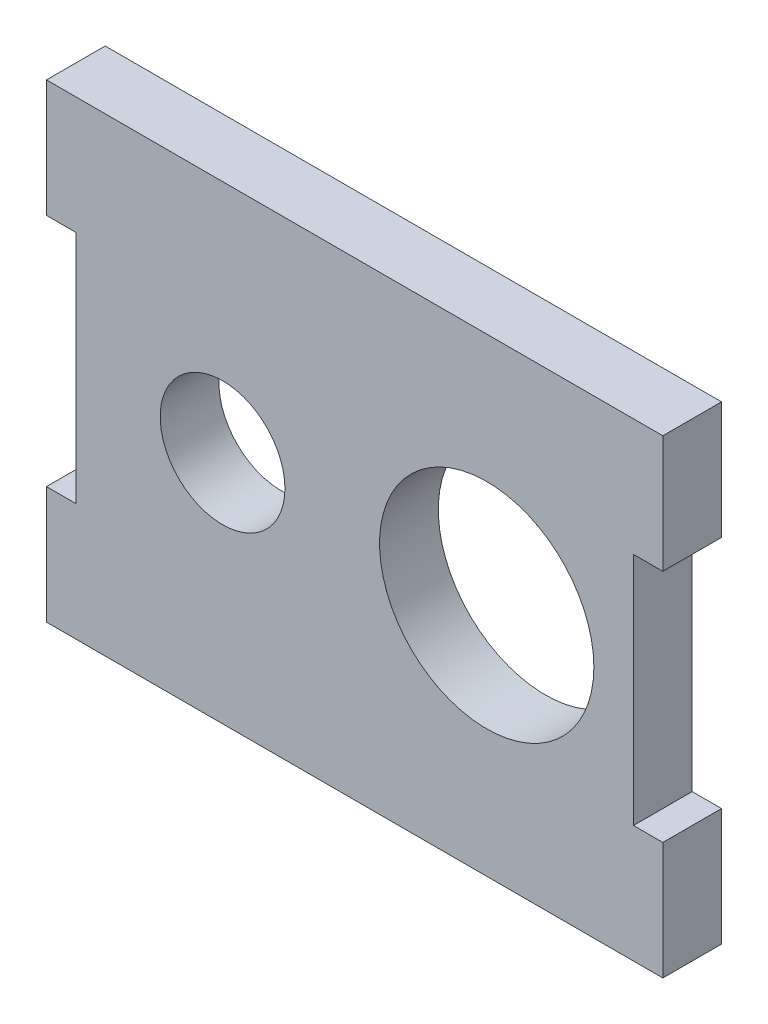
ISO-10303-21;
HEADER;
FILE_DESCRIPTION(('STEP AP214'),'2;1');
FILE_NAME('part.step','',(''),(''),'','','');
FILE_SCHEMA(('AUTOMOTIVE_DESIGN { 1 0 10303 214 1 1 1 1 }'));
ENDSEC;
DATA;
#1=APPLICATION_CONTEXT('core data for automotive mechanical design processes');
#2=APPLICATION_PROTOCOL_DEFINITION('international standard','automotive_design',2000,#1);
#3=PRODUCT_CONTEXT('',#1,'mechanical');
#4=PRODUCT('Part','Part','',(#3));
#5=PRODUCT_RELATED_PRODUCT_CATEGORY('part','',(#4));
#6=PRODUCT_DEFINITION_FORMATION('','',#4);
#7=PRODUCT_DEFINITION_CONTEXT('part definition',#1,'design');
#8=PRODUCT_DEFINITION('design','',#6,#7);
#9=PRODUCT_DEFINITION_SHAPE('','',#8);
#10=(LENGTH_UNIT() NAMED_UNIT(*) SI_UNIT(.MILLI.,.METRE.));
#11=(NAMED_UNIT(*) PLANE_ANGLE_UNIT() SI_UNIT($,.RADIAN.));
#12=(NAMED_UNIT(*) SI_UNIT($,.STERADIAN.) SOLID_ANGLE_UNIT());
#13=UNCERTAINTY_MEASURE_WITH_UNIT(LENGTH_MEASURE(1.E-05),#10,'distance_accuracy_value','');
#14=(GEOMETRIC_REPRESENTATION_CONTEXT(3) GLOBAL_UNCERTAINTY_ASSIGNED_CONTEXT((#13)) GLOBAL_UNIT_ASSIGNED_CONTEXT((#10,
#11,#12)) REPRESENTATION_CONTEXT('',''));
#15=CARTESIAN_POINT('',(0.,0.,0.));
#16=DIRECTION('',(0.,0.,1.));
#17=DIRECTION('',(1.,0.,0.));
#18=AXIS2_PLACEMENT_3D('',#15,#16,#17);
#19=CARTESIAN_POINT('',(543.697024667252,-402.673514651459,2.));
#20=DIRECTION('',(0.,0.,-1.));
#21=DIRECTION('',(-1.,0.,0.));
#22=AXIS2_PLACEMENT_3D('',#19,#20,#21);
#23=PLANE('',#22);
#24=DIRECTION('',(0.,1.,0.));
#25=VECTOR('',#24,1.);
#26=CARTESIAN_POINT('',(543.697024667252,-406.673514651459,2.));
#27=LINE('',#26,#25);
#28=CARTESIAN_POINT('',(543.697024667252,-406.673514651459,2.));
#29=VERTEX_POINT('',#28);
#30=CARTESIAN_POINT('',(543.697024667252,-402.673514651459,2.));
#31=VERTEX_POINT('',#30);
#32=EDGE_CURVE('E181',#29,#31,#27,.T.);
#33=ORIENTED_EDGE('',*,*,#32,.T.);
#34=DIRECTION('',(-1.,0.,0.));
#35=VECTOR('',#34,1.);
#36=CARTESIAN_POINT('',(542.697024667252,-402.673514651459,2.));
#37=LINE('',#36,#35);
#38=CARTESIAN_POINT('',(542.697024667252,-402.673514651459,2.));
#39=VERTEX_POINT('',#38);
#40=EDGE_CURVE('E109',#31,#39,#37,.T.);
#41=ORIENTED_EDGE('',*,*,#40,.T.);
#42=DIRECTION('',(0.,1.,0.));
#43=VECTOR('',#42,1.);
#44=CARTESIAN_POINT('',(542.697024667252,-394.673514651459,2.));
#45=LINE('',#44,#43);
#46=CARTESIAN_POINT('',(542.697024667252,-394.673514651459,2.));
#47=VERTEX_POINT('',#46);
#48=EDGE_CURVE('E208',#39,#47,#45,.T.);
#49=ORIENTED_EDGE('',*,*,#48,.T.);
#50=DIRECTION('',(1.,0.,0.));
#51=VECTOR('',#50,1.);
#52=CARTESIAN_POINT('',(542.697024667252,-394.673514651459,2.));
#53=LINE('',#52,#51);
#54=CARTESIAN_POINT('',(543.697024667252,-394.673514651459,2.));
#55=VERTEX_POINT('',#54);
#56=EDGE_CURVE('E227',#47,#55,#53,.T.);
#57=ORIENTED_EDGE('',*,*,#56,.T.);
#58=DIRECTION('',(0.,1.,0.));
#59=VECTOR('',#58,1.);
#60=CARTESIAN_POINT('',(543.697024667252,-394.673514651459,2.));
#61=LINE('',#60,#59);
#62=CARTESIAN_POINT('',(543.697024667252,-390.673514651459,2.));
#63=VERTEX_POINT('',#62);
#64=EDGE_CURVE('E224',#55,#63,#61,.T.);
#65=ORIENTED_EDGE('',*,*,#64,.T.);
#66=DIRECTION('',(-1.,0.,0.));
#67=VECTOR('',#66,1.);
#68=CARTESIAN_POINT('',(543.697024667252,-390.673514651459,2.));
#69=LINE('',#68,#67);
#70=CARTESIAN_POINT('',(522.697024667252,-390.673514651459,2.));
#71=VERTEX_POINT('',#70);
#72=EDGE_CURVE('E226',#63,#71,#69,.T.);
#73=ORIENTED_EDGE('',*,*,#72,.T.);
#74=DIRECTION('',(0.,-1.,0.));
#75=VECTOR('',#74,1.);
#76=CARTESIAN_POINT('',(522.697024667252,-394.673514651459,2.));
#77=LINE('',#76,#75);
#78=CARTESIAN_POINT('',(522.697024667252,-394.673514651459,2.));
#79=VERTEX_POINT('',#78);
#80=EDGE_CURVE('E229',#71,#79,#77,.T.);
#81=ORIENTED_EDGE('',*,*,#80,.T.);
#82=DIRECTION('',(1.,0.,0.));
#83=VECTOR('',#82,1.);
#84=CARTESIAN_POINT('',(522.697024667252,-394.673514651459,2.));
#85=LINE('',#84,#83);
#86=CARTESIAN_POINT('',(523.697024667252,-394.673514651459,2.));
#87=VERTEX_POINT('',#86);
#88=EDGE_CURVE('E235',#79,#87,#85,.T.);
#89=ORIENTED_EDGE('',*,*,#88,.T.);
#90=DIRECTION('',(0.,-1.,0.));
#91=VECTOR('',#90,1.);
#92=CARTESIAN_POINT('',(523.697024667252,-394.673514651459,2.));
#93=LINE('',#92,#91);
#94=CARTESIAN_POINT('',(523.697024667252,-402.673514651459,2.));
#95=VERTEX_POINT('',#94);
#96=EDGE_CURVE('E140',#87,#95,#93,.T.);
#97=ORIENTED_EDGE('',*,*,#96,.T.);
#98=DIRECTION('',(-1.,0.,0.));
#99=VECTOR('',#98,1.);
#100=CARTESIAN_POINT('',(522.697024667252,-402.673514651459,2.));
#101=LINE('',#100,#99);
#102=CARTESIAN_POINT('',(522.697024667252,-402.673514651459,2.));
#103=VERTEX_POINT('',#102);
#104=EDGE_CURVE('E134',#95,#103,#101,.T.);
#105=ORIENTED_EDGE('',*,*,#104,.T.);
#106=DIRECTION('',(0.,-1.,0.));
#107=VECTOR('',#106,1.);
#108=CARTESIAN_POINT('',(522.697024667252,-406.673514651459,2.));
#109=LINE('',#108,#107);
#110=CARTESIAN_POINT('',(522.697024667252,-406.673514651459,2.));
#111=VERTEX_POINT('',#110);
#112=EDGE_CURVE('E138',#103,#111,#109,.T.);
#113=ORIENTED_EDGE('',*,*,#112,.T.);
#114=DIRECTION('',(1.,0.,0.));
#115=VECTOR('',#114,1.);
#116=CARTESIAN_POINT('',(543.697024667252,-406.673514651459,2.));
#117=LINE('',#116,#115);
#118=EDGE_CURVE('E54',#111,#29,#117,.T.);
#119=ORIENTED_EDGE('',*,*,#118,.T.);
#120=EDGE_LOOP('',(#33,#41,#49,#57,#65,#73,#81,#89,#97,#105,#113,#119));
#121=FACE_BOUND('',#120,.T.);
#122=CARTESIAN_POINT('',(537.697024667252,-398.673514651459,2.));
#123=DIRECTION('',(0.,0.,1.));
#124=DIRECTION('',(1.,0.,0.));
#125=AXIS2_PLACEMENT_3D('',#122,#123,#124);
#126=CIRCLE('',#125,3.65000000000004);
#127=CARTESIAN_POINT('',(541.347024667252,-398.673514651459,2.));
#128=VERTEX_POINT('',#127);
#129=EDGE_CURVE('E162',#128,#128,#126,.T.);
#130=ORIENTED_EDGE('',*,*,#129,.F.);
#131=EDGE_LOOP('',(#130));
#132=FACE_BOUND('',#131,.T.);
#133=CARTESIAN_POINT('',(528.697024667252,-398.673514651459,2.));
#134=DIRECTION('',(0.,0.,1.));
#135=DIRECTION('',(1.,0.,0.));
#136=AXIS2_PLACEMENT_3D('',#133,#134,#135);
#137=CIRCLE('',#136,2.12500000000001);
#138=CARTESIAN_POINT('',(530.822024667252,-398.673514651459,2.));
#139=VERTEX_POINT('',#138);
#140=EDGE_CURVE('E276',#139,#139,#137,.T.);
#141=ORIENTED_EDGE('',*,*,#140,.F.);
#142=EDGE_LOOP('',(#141));
#143=FACE_BOUND('',#142,.T.);
#144=ADVANCED_FACE('F37',(#121,#132,#143),#23,.F.);
#145=CARTESIAN_POINT('',(543.697024667252,-402.673514651459,0.));
#146=DIRECTION('',(0.,0.,-1.));
#147=DIRECTION('',(-1.,0.,0.));
#148=AXIS2_PLACEMENT_3D('',#145,#146,#147);
#149=PLANE('',#148);
#150=CARTESIAN_POINT('',(537.697024667252,-398.673514651459,0.));
#151=DIRECTION('',(0.,0.,1.));
#152=DIRECTION('',(1.,0.,0.));
#153=AXIS2_PLACEMENT_3D('',#150,#151,#152);
#154=CIRCLE('',#153,3.65000000000004);
#155=CARTESIAN_POINT('',(541.347024667252,-398.673514651459,0.));
#156=VERTEX_POINT('',#155);
#157=EDGE_CURVE('E281',#156,#156,#154,.T.);
#158=ORIENTED_EDGE('',*,*,#157,.T.);
#159=EDGE_LOOP('',(#158));
#160=FACE_BOUND('',#159,.T.);
#161=DIRECTION('',(0.,1.,0.));
#162=VECTOR('',#161,1.);
#163=CARTESIAN_POINT('',(543.697024667252,-406.673514651459,0.));
#164=LINE('',#163,#162);
#165=CARTESIAN_POINT('',(543.697024667252,-406.673514651459,0.));
#166=VERTEX_POINT('',#165);
#167=CARTESIAN_POINT('',(543.697024667252,-402.673514651459,0.));
#168=VERTEX_POINT('',#167);
#169=EDGE_CURVE('E158',#166,#168,#164,.T.);
#170=ORIENTED_EDGE('',*,*,#169,.F.);
#171=DIRECTION('',(1.,0.,0.));
#172=VECTOR('',#171,1.);
#173=CARTESIAN_POINT('',(543.697024667252,-406.673514651459,0.));
#174=LINE('',#173,#172);
#175=CARTESIAN_POINT('',(522.697024667252,-406.673514651459,0.));
#176=VERTEX_POINT('',#175);
#177=EDGE_CURVE('E101',#176,#166,#174,.T.);
#178=ORIENTED_EDGE('',*,*,#177,.F.);
#179=DIRECTION('',(0.,-1.,0.));
#180=VECTOR('',#179,1.);
#181=CARTESIAN_POINT('',(522.697024667252,-406.673514651459,0.));
#182=LINE('',#181,#180);
#183=CARTESIAN_POINT('',(522.697024667252,-402.673514651459,0.));
#184=VERTEX_POINT('',#183);
#185=EDGE_CURVE('E95',#184,#176,#182,.T.);
#186=ORIENTED_EDGE('',*,*,#185,.F.);
#187=DIRECTION('',(-1.,0.,0.));
#188=VECTOR('',#187,1.);
#189=CARTESIAN_POINT('',(522.697024667252,-402.673514651459,0.));
#190=LINE('',#189,#188);
#191=CARTESIAN_POINT('',(523.697024667252,-402.673514651459,0.));
#192=VERTEX_POINT('',#191);
#193=EDGE_CURVE('E148',#192,#184,#190,.T.);
#194=ORIENTED_EDGE('',*,*,#193,.F.);
#195=DIRECTION('',(0.,-1.,0.));
#196=VECTOR('',#195,1.);
#197=CARTESIAN_POINT('',(523.697024667252,-394.673514651459,0.));
#198=LINE('',#197,#196);
#199=CARTESIAN_POINT('',(523.697024667252,-394.673514651459,0.));
#200=VERTEX_POINT('',#199);
#201=EDGE_CURVE('E176',#200,#192,#198,.T.);
#202=ORIENTED_EDGE('',*,*,#201,.F.);
#203=DIRECTION('',(1.,0.,0.));
#204=VECTOR('',#203,1.);
#205=CARTESIAN_POINT('',(522.697024667252,-394.673514651459,0.));
#206=LINE('',#205,#204);
#207=CARTESIAN_POINT('',(522.697024667252,-394.673514651459,0.));
#208=VERTEX_POINT('',#207);
#209=EDGE_CURVE('E174',#208,#200,#206,.T.);
#210=ORIENTED_EDGE('',*,*,#209,.F.);
#211=DIRECTION('',(0.,-1.,0.));
#212=VECTOR('',#211,1.);
#213=CARTESIAN_POINT('',(522.697024667252,-394.673514651459,0.));
#214=LINE('',#213,#212);
#215=CARTESIAN_POINT('',(522.697024667252,-390.673514651459,0.));
#216=VERTEX_POINT('',#215);
#217=EDGE_CURVE('E172',#216,#208,#214,.T.);
#218=ORIENTED_EDGE('',*,*,#217,.F.);
#219=DIRECTION('',(-1.,0.,0.));
#220=VECTOR('',#219,1.);
#221=CARTESIAN_POINT('',(543.697024667252,-390.673514651459,0.));
#222=LINE('',#221,#220);
#223=CARTESIAN_POINT('',(543.697024667252,-390.673514651459,0.));
#224=VERTEX_POINT('',#223);
#225=EDGE_CURVE('E170',#224,#216,#222,.T.);
#226=ORIENTED_EDGE('',*,*,#225,.F.);
#227=DIRECTION('',(0.,1.,0.));
#228=VECTOR('',#227,1.);
#229=CARTESIAN_POINT('',(543.697024667252,-394.673514651459,0.));
#230=LINE('',#229,#228);
#231=CARTESIAN_POINT('',(543.697024667252,-394.673514651459,0.));
#232=VERTEX_POINT('',#231);
#233=EDGE_CURVE('E168',#232,#224,#230,.T.);
#234=ORIENTED_EDGE('',*,*,#233,.F.);
#235=DIRECTION('',(1.,0.,0.));
#236=VECTOR('',#235,1.);
#237=CARTESIAN_POINT('',(542.697024667252,-394.673514651459,0.));
#238=LINE('',#237,#236);
#239=CARTESIAN_POINT('',(542.697024667252,-394.673514651459,0.));
#240=VERTEX_POINT('',#239);
#241=EDGE_CURVE('E166',#240,#232,#238,.T.);
#242=ORIENTED_EDGE('',*,*,#241,.F.);
#243=DIRECTION('',(0.,1.,0.));
#244=VECTOR('',#243,1.);
#245=CARTESIAN_POINT('',(542.697024667252,-394.673514651459,0.));
#246=LINE('',#245,#244);
#247=CARTESIAN_POINT('',(542.697024667252,-402.673514651459,0.));
#248=VERTEX_POINT('',#247);
#249=EDGE_CURVE('E164',#248,#240,#246,.T.);
#250=ORIENTED_EDGE('',*,*,#249,.F.);
#251=DIRECTION('',(-1.,0.,0.));
#252=VECTOR('',#251,1.);
#253=CARTESIAN_POINT('',(542.697024667252,-402.673514651459,0.));
#254=LINE('',#253,#252);
#255=EDGE_CURVE('E161',#168,#248,#254,.T.);
#256=ORIENTED_EDGE('',*,*,#255,.F.);
#257=EDGE_LOOP('',(#170,#178,#186,#194,#202,#210,#218,#226,#234,#242,#250,#256));
#258=FACE_BOUND('',#257,.T.);
#259=CARTESIAN_POINT('',(528.697024667252,-398.673514651459,0.));
#260=DIRECTION('',(0.,0.,1.));
#261=DIRECTION('',(1.,0.,0.));
#262=AXIS2_PLACEMENT_3D('',#259,#260,#261);
#263=CIRCLE('',#262,2.12500000000001);
#264=CARTESIAN_POINT('',(530.822024667252,-398.673514651459,0.));
#265=VERTEX_POINT('',#264);
#266=EDGE_CURVE('E279',#265,#265,#263,.T.);
#267=ORIENTED_EDGE('',*,*,#266,.T.);
#268=EDGE_LOOP('',(#267));
#269=FACE_BOUND('',#268,.T.);
#270=ADVANCED_FACE('F212',(#160,#258,#269),#149,.T.);
#271=CARTESIAN_POINT('',(543.697024667252,-406.673514651459,2.));
#272=DIRECTION('',(-1.,0.,0.));
#273=DIRECTION('',(0.,0.,1.));
#274=AXIS2_PLACEMENT_3D('',#271,#272,#273);
#275=PLANE('',#274);
#276=ORIENTED_EDGE('',*,*,#169,.T.);
#277=DIRECTION('',(0.,0.,-1.));
#278=VECTOR('',#277,1.);
#279=CARTESIAN_POINT('',(543.697024667252,-402.673514651459,2.));
#280=LINE('',#279,#278);
#281=EDGE_CURVE('E11',#31,#168,#280,.T.);
#282=ORIENTED_EDGE('',*,*,#281,.F.);
#283=ORIENTED_EDGE('',*,*,#32,.F.);
#284=DIRECTION('',(0.,0.,-1.));
#285=VECTOR('',#284,1.);
#286=CARTESIAN_POINT('',(543.697024667252,-406.673514651459,2.));
#287=LINE('',#286,#285);
#288=EDGE_CURVE('E154',#29,#166,#287,.T.);
#289=ORIENTED_EDGE('',*,*,#288,.T.);
#290=EDGE_LOOP('',(#276,#282,#283,#289));
#291=FACE_BOUND('',#290,.T.);
#292=ADVANCED_FACE('F39',(#291),#275,.F.);
#293=CARTESIAN_POINT('',(542.697024667252,-402.673514651459,2.));
#294=DIRECTION('',(0.,-1.,0.));
#295=DIRECTION('',(0.,0.,-1.));
#296=AXIS2_PLACEMENT_3D('',#293,#294,#295);
#297=PLANE('',#296);
#298=ORIENTED_EDGE('',*,*,#255,.T.);
#299=DIRECTION('',(0.,0.,-1.));
#300=VECTOR('',#299,1.);
#301=CARTESIAN_POINT('',(542.697024667252,-402.673514651459,2.));
#302=LINE('',#301,#300);
#303=EDGE_CURVE('E46',#39,#248,#302,.T.);
#304=ORIENTED_EDGE('',*,*,#303,.F.);
#305=ORIENTED_EDGE('',*,*,#40,.F.);
#306=ORIENTED_EDGE('',*,*,#281,.T.);
#307=EDGE_LOOP('',(#298,#304,#305,#306));
#308=FACE_BOUND('',#307,.T.);
#309=ADVANCED_FACE('F356',(#308),#297,.F.);
#310=CARTESIAN_POINT('',(542.697024667252,-394.673514651459,2.));
#311=DIRECTION('',(-1.,0.,0.));
#312=DIRECTION('',(0.,0.,1.));
#313=AXIS2_PLACEMENT_3D('',#310,#311,#312);
#314=PLANE('',#313);
#315=ORIENTED_EDGE('',*,*,#249,.T.);
#316=DIRECTION('',(0.,0.,-1.));
#317=VECTOR('',#316,1.);
#318=CARTESIAN_POINT('',(542.697024667252,-394.673514651459,2.));
#319=LINE('',#318,#317);
#320=EDGE_CURVE('E200',#47,#240,#319,.T.);
#321=ORIENTED_EDGE('',*,*,#320,.F.);
#322=ORIENTED_EDGE('',*,*,#48,.F.);
#323=ORIENTED_EDGE('',*,*,#303,.T.);
#324=EDGE_LOOP('',(#315,#321,#322,#323));
#325=FACE_BOUND('',#324,.T.);
#326=ADVANCED_FACE('F206',(#325),#314,.F.);
#327=CARTESIAN_POINT('',(542.697024667252,-394.673514651459,2.));
#328=DIRECTION('',(0.,1.,0.));
#329=DIRECTION('',(0.,0.,1.));
#330=AXIS2_PLACEMENT_3D('',#327,#328,#329);
#331=PLANE('',#330);
#332=ORIENTED_EDGE('',*,*,#241,.T.);
#333=DIRECTION('',(0.,0.,-1.));
#334=VECTOR('',#333,1.);
#335=CARTESIAN_POINT('',(543.697024667252,-394.673514651459,2.));
#336=LINE('',#335,#334);
#337=EDGE_CURVE('E197',#55,#232,#336,.T.);
#338=ORIENTED_EDGE('',*,*,#337,.F.);
#339=ORIENTED_EDGE('',*,*,#56,.F.);
#340=ORIENTED_EDGE('',*,*,#320,.T.);
#341=EDGE_LOOP('',(#332,#338,#339,#340));
#342=FACE_BOUND('',#341,.T.);
#343=ADVANCED_FACE('F218',(#342),#331,.F.);
#344=CARTESIAN_POINT('',(543.697024667252,-394.673514651459,2.));
#345=DIRECTION('',(-1.,0.,0.));
#346=DIRECTION('',(0.,0.,1.));
#347=AXIS2_PLACEMENT_3D('',#344,#345,#346);
#348=PLANE('',#347);
#349=ORIENTED_EDGE('',*,*,#233,.T.);
#350=DIRECTION('',(0.,0.,-1.));
#351=VECTOR('',#350,1.);
#352=CARTESIAN_POINT('',(543.697024667252,-390.673514651459,2.));
#353=LINE('',#352,#351);
#354=EDGE_CURVE('E194',#63,#224,#353,.T.);
#355=ORIENTED_EDGE('',*,*,#354,.F.);
#356=ORIENTED_EDGE('',*,*,#64,.F.);
#357=ORIENTED_EDGE('',*,*,#337,.T.);
#358=EDGE_LOOP('',(#349,#355,#356,#357));
#359=FACE_BOUND('',#358,.T.);
#360=ADVANCED_FACE('F222',(#359),#348,.F.);
#361=CARTESIAN_POINT('',(543.697024667252,-390.673514651459,2.));
#362=DIRECTION('',(0.,-1.,0.));
#363=DIRECTION('',(0.,0.,-1.));
#364=AXIS2_PLACEMENT_3D('',#361,#362,#363);
#365=PLANE('',#364);
#366=ORIENTED_EDGE('',*,*,#225,.T.);
#367=DIRECTION('',(0.,0.,-1.));
#368=VECTOR('',#367,1.);
#369=CARTESIAN_POINT('',(522.697024667252,-390.673514651459,2.));
#370=LINE('',#369,#368);
#371=EDGE_CURVE('E191',#71,#216,#370,.T.);
#372=ORIENTED_EDGE('',*,*,#371,.F.);
#373=ORIENTED_EDGE('',*,*,#72,.F.);
#374=ORIENTED_EDGE('',*,*,#354,.T.);
#375=EDGE_LOOP('',(#366,#372,#373,#374));
#376=FACE_BOUND('',#375,.T.);
#377=ADVANCED_FACE('F329',(#376),#365,.F.);
#378=CARTESIAN_POINT('',(522.697024667252,-394.673514651459,2.));
#379=DIRECTION('',(1.,0.,0.));
#380=DIRECTION('',(0.,0.,-1.));
#381=AXIS2_PLACEMENT_3D('',#378,#379,#380);
#382=PLANE('',#381);
#383=ORIENTED_EDGE('',*,*,#217,.T.);
#384=DIRECTION('',(0.,0.,-1.));
#385=VECTOR('',#384,1.);
#386=CARTESIAN_POINT('',(522.697024667252,-394.673514651459,2.));
#387=LINE('',#386,#385);
#388=EDGE_CURVE('E188',#79,#208,#387,.T.);
#389=ORIENTED_EDGE('',*,*,#388,.F.);
#390=ORIENTED_EDGE('',*,*,#80,.F.);
#391=ORIENTED_EDGE('',*,*,#371,.T.);
#392=EDGE_LOOP('',(#383,#389,#390,#391));
#393=FACE_BOUND('',#392,.T.);
#394=ADVANCED_FACE('F322',(#393),#382,.F.);
#395=CARTESIAN_POINT('',(522.697024667252,-394.673514651459,2.));
#396=DIRECTION('',(0.,1.,0.));
#397=DIRECTION('',(0.,0.,1.));
#398=AXIS2_PLACEMENT_3D('',#395,#396,#397);
#399=PLANE('',#398);
#400=ORIENTED_EDGE('',*,*,#209,.T.);
#401=DIRECTION('',(0.,0.,-1.));
#402=VECTOR('',#401,1.);
#403=CARTESIAN_POINT('',(523.697024667252,-394.673514651459,2.));
#404=LINE('',#403,#402);
#405=EDGE_CURVE('E185',#87,#200,#404,.T.);
#406=ORIENTED_EDGE('',*,*,#405,.F.);
#407=ORIENTED_EDGE('',*,*,#88,.F.);
#408=ORIENTED_EDGE('',*,*,#388,.T.);
#409=EDGE_LOOP('',(#400,#406,#407,#408));
#410=FACE_BOUND('',#409,.T.);
#411=ADVANCED_FACE('F241',(#410),#399,.F.);
#412=CARTESIAN_POINT('',(523.697024667252,-394.673514651459,2.));
#413=DIRECTION('',(1.,0.,0.));
#414=DIRECTION('',(0.,0.,-1.));
#415=AXIS2_PLACEMENT_3D('',#412,#413,#414);
#416=PLANE('',#415);
#417=ORIENTED_EDGE('',*,*,#201,.T.);
#418=DIRECTION('',(0.,0.,-1.));
#419=VECTOR('',#418,1.);
#420=CARTESIAN_POINT('',(523.697024667252,-402.673514651459,2.));
#421=LINE('',#420,#419);
#422=EDGE_CURVE('E149',#95,#192,#421,.T.);
#423=ORIENTED_EDGE('',*,*,#422,.F.);
#424=ORIENTED_EDGE('',*,*,#96,.F.);
#425=ORIENTED_EDGE('',*,*,#405,.T.);
#426=EDGE_LOOP('',(#417,#423,#424,#425));
#427=FACE_BOUND('',#426,.T.);
#428=ADVANCED_FACE('F245',(#427),#416,.F.);
#429=CARTESIAN_POINT('',(522.697024667252,-402.673514651459,2.));
#430=DIRECTION('',(0.,-1.,0.));
#431=DIRECTION('',(0.,0.,-1.));
#432=AXIS2_PLACEMENT_3D('',#429,#430,#431);
#433=PLANE('',#432);
#434=ORIENTED_EDGE('',*,*,#193,.T.);
#435=DIRECTION('',(0.,0.,-1.));
#436=VECTOR('',#435,1.);
#437=CARTESIAN_POINT('',(522.697024667252,-402.673514651459,2.));
#438=LINE('',#437,#436);
#439=EDGE_CURVE('E145',#103,#184,#438,.T.);
#440=ORIENTED_EDGE('',*,*,#439,.F.);
#441=ORIENTED_EDGE('',*,*,#104,.F.);
#442=ORIENTED_EDGE('',*,*,#422,.T.);
#443=EDGE_LOOP('',(#434,#440,#441,#442));
#444=FACE_BOUND('',#443,.T.);
#445=ADVANCED_FACE('F146',(#444),#433,.F.);
#446=CARTESIAN_POINT('',(522.697024667252,-406.673514651459,2.));
#447=DIRECTION('',(1.,0.,0.));
#448=DIRECTION('',(0.,0.,-1.));
#449=AXIS2_PLACEMENT_3D('',#446,#447,#448);
#450=PLANE('',#449);
#451=ORIENTED_EDGE('',*,*,#185,.T.);
#452=DIRECTION('',(0.,0.,-1.));
#453=VECTOR('',#452,1.);
#454=CARTESIAN_POINT('',(522.697024667252,-406.673514651459,2.));
#455=LINE('',#454,#453);
#456=EDGE_CURVE('E150',#111,#176,#455,.T.);
#457=ORIENTED_EDGE('',*,*,#456,.F.);
#458=ORIENTED_EDGE('',*,*,#112,.F.);
#459=ORIENTED_EDGE('',*,*,#439,.T.);
#460=EDGE_LOOP('',(#451,#457,#458,#459));
#461=FACE_BOUND('',#460,.T.);
#462=ADVANCED_FACE('F152',(#461),#450,.F.);
#463=CARTESIAN_POINT('',(543.697024667252,-406.673514651459,2.));
#464=DIRECTION('',(0.,1.,0.));
#465=DIRECTION('',(0.,0.,1.));
#466=AXIS2_PLACEMENT_3D('',#463,#464,#465);
#467=PLANE('',#466);
#468=ORIENTED_EDGE('',*,*,#177,.T.);
#469=ORIENTED_EDGE('',*,*,#288,.F.);
#470=ORIENTED_EDGE('',*,*,#118,.F.);
#471=ORIENTED_EDGE('',*,*,#456,.T.);
#472=EDGE_LOOP('',(#468,#469,#470,#471));
#473=FACE_BOUND('',#472,.T.);
#474=ADVANCED_FACE('F249',(#473),#467,.F.);
#475=CARTESIAN_POINT('',(537.697024667252,-398.673514651459,2.));
#476=DIRECTION('',(0.,0.,-1.));
#477=DIRECTION('',(-1.,0.,0.));
#478=AXIS2_PLACEMENT_3D('',#475,#476,#477);
#479=CYLINDRICAL_SURFACE('',#478,3.65000000000004);
#480=ORIENTED_EDGE('',*,*,#129,.T.);
#481=EDGE_LOOP('',(#480));
#482=FACE_BOUND('',#481,.T.);
#483=ORIENTED_EDGE('',*,*,#157,.F.);
#484=EDGE_LOOP('',(#483));
#485=FACE_BOUND('',#484,.T.);
#486=ADVANCED_FACE('F251',(#482,#485),#479,.F.);
#487=CARTESIAN_POINT('',(528.697024667252,-398.673514651459,2.));
#488=DIRECTION('',(0.,0.,-1.));
#489=DIRECTION('',(-1.,0.,0.));
#490=AXIS2_PLACEMENT_3D('',#487,#488,#489);
#491=CYLINDRICAL_SURFACE('',#490,2.12500000000001);
#492=ORIENTED_EDGE('',*,*,#140,.T.);
#493=EDGE_LOOP('',(#492));
#494=FACE_BOUND('',#493,.T.);
#495=ORIENTED_EDGE('',*,*,#266,.F.);
#496=EDGE_LOOP('',(#495));
#497=FACE_BOUND('',#496,.T.);
#498=ADVANCED_FACE('F257',(#494,#497),#491,.F.);
#499=CLOSED_SHELL('',(#144,#270,#292,#309,#326,#343,#360,#377,#394,#411,#428,#445,#462,#474,
#486,#498));
#500=MANIFOLD_SOLID_BREP('B2',#499);
#501=ADVANCED_BREP_SHAPE_REPRESENTATION('',(#18,#500),#14);
#502=SHAPE_DEFINITION_REPRESENTATION(#9,#501);
ENDSEC;
END-ISO-10303-21;
